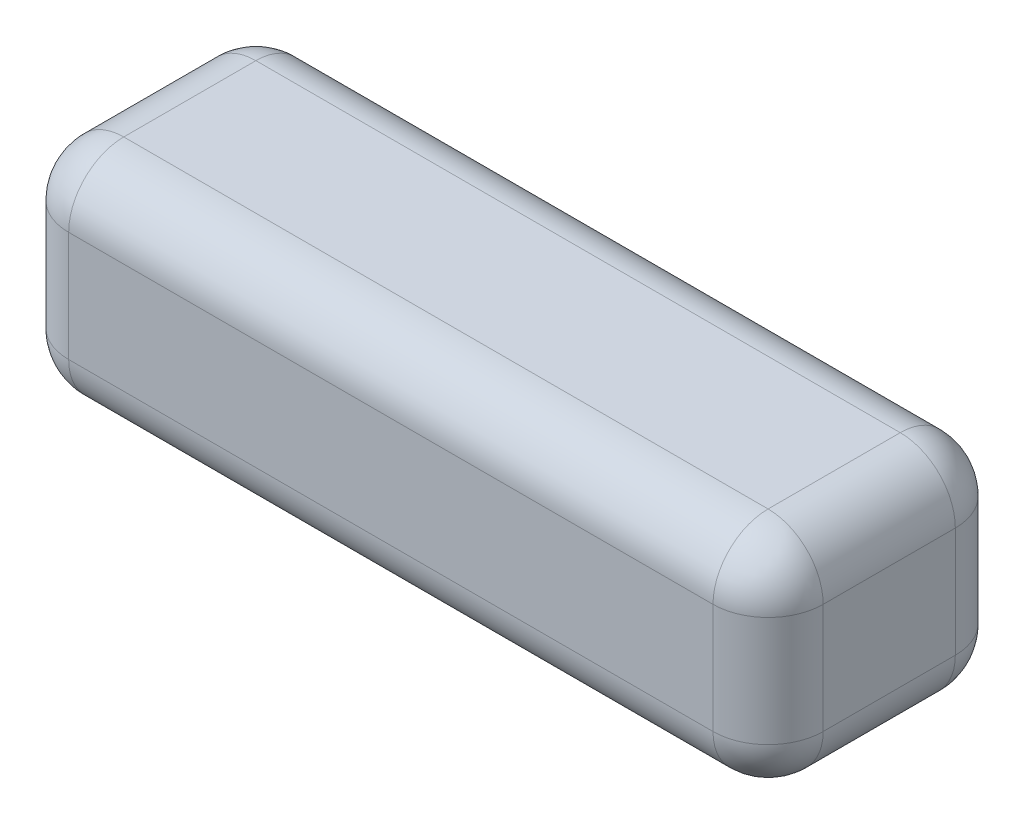
ISO-10303-21;
HEADER;
FILE_DESCRIPTION(('STEP AP214'),'2;1');
FILE_NAME('part.step','',(''),(''),'','','');
FILE_SCHEMA(('AUTOMOTIVE_DESIGN { 1 0 10303 214 1 1 1 1 }'));
ENDSEC;
DATA;
#1=APPLICATION_CONTEXT('core data for automotive mechanical design processes');
#2=APPLICATION_PROTOCOL_DEFINITION('international standard','automotive_design',2000,#1);
#3=PRODUCT_CONTEXT('',#1,'mechanical');
#4=PRODUCT('Part','Part','',(#3));
#5=PRODUCT_RELATED_PRODUCT_CATEGORY('part','',(#4));
#6=PRODUCT_DEFINITION_FORMATION('','',#4);
#7=PRODUCT_DEFINITION_CONTEXT('part definition',#1,'design');
#8=PRODUCT_DEFINITION('design','',#6,#7);
#9=PRODUCT_DEFINITION_SHAPE('','',#8);
#10=(LENGTH_UNIT() NAMED_UNIT(*) SI_UNIT(.MILLI.,.METRE.));
#11=(NAMED_UNIT(*) PLANE_ANGLE_UNIT() SI_UNIT($,.RADIAN.));
#12=(NAMED_UNIT(*) SI_UNIT($,.STERADIAN.) SOLID_ANGLE_UNIT());
#13=UNCERTAINTY_MEASURE_WITH_UNIT(LENGTH_MEASURE(1.E-05),#10,'distance_accuracy_value','');
#14=(GEOMETRIC_REPRESENTATION_CONTEXT(3) GLOBAL_UNCERTAINTY_ASSIGNED_CONTEXT((#13)) GLOBAL_UNIT_ASSIGNED_CONTEXT((#10,
#11,#12)) REPRESENTATION_CONTEXT('',''));
#15=CARTESIAN_POINT('',(0.,0.,0.));
#16=DIRECTION('',(0.,0.,1.));
#17=DIRECTION('',(1.,0.,0.));
#18=AXIS2_PLACEMENT_3D('',#15,#16,#17);
#19=CARTESIAN_POINT('',(-32.6857142857143,40.,-18.368253968254));
#20=DIRECTION('',(1.,0.,0.));
#21=DIRECTION('',(0.,0.,-1.));
#22=AXIS2_PLACEMENT_3D('',#19,#20,#21);
#23=PLANE('',#22);
#24=DIRECTION('',(0.,-1.,0.));
#25=VECTOR('',#24,1.);
#26=CARTESIAN_POINT('',(-32.6857142857143,40.,-8.36825396825397));
#27=LINE('',#26,#25);
#28=CARTESIAN_POINT('',(-32.6857142857143,30.,-8.36825396825397));
#29=VERTEX_POINT('',#28);
#30=CARTESIAN_POINT('',(-32.6857142857143,10.,-8.36825396825397));
#31=VERTEX_POINT('',#30);
#32=EDGE_CURVE('E146',#29,#31,#27,.T.);
#33=ORIENTED_EDGE('',*,*,#32,.T.);
#34=DIRECTION('',(0.,0.,1.));
#35=VECTOR('',#34,1.);
#36=CARTESIAN_POINT('',(-32.6857142857143,10.,-18.368253968254));
#37=LINE('',#36,#35);
#38=CARTESIAN_POINT('',(-32.6857142857143,10.,15.631746031746));
#39=VERTEX_POINT('',#38);
#40=EDGE_CURVE('E141',#31,#39,#37,.T.);
#41=ORIENTED_EDGE('',*,*,#40,.T.);
#42=DIRECTION('',(0.,-1.,0.));
#43=VECTOR('',#42,1.);
#44=CARTESIAN_POINT('',(-32.6857142857143,40.,15.631746031746));
#45=LINE('',#44,#43);
#46=CARTESIAN_POINT('',(-32.6857142857143,30.,15.631746031746));
#47=VERTEX_POINT('',#46);
#48=EDGE_CURVE('E136',#39,#47,#45,.F.);
#49=ORIENTED_EDGE('',*,*,#48,.T.);
#50=DIRECTION('',(0.,0.,1.));
#51=VECTOR('',#50,1.);
#52=CARTESIAN_POINT('',(-32.6857142857143,30.,-18.368253968254));
#53=LINE('',#52,#51);
#54=EDGE_CURVE('E138',#47,#29,#53,.F.);
#55=ORIENTED_EDGE('',*,*,#54,.T.);
#56=EDGE_LOOP('',(#33,#41,#49,#55));
#57=FACE_BOUND('',#56,.T.);
#58=ADVANCED_FACE('F46',(#57),#23,.F.);
#59=CARTESIAN_POINT('',(-32.6857142857143,40.,25.631746031746));
#60=DIRECTION('',(0.,0.,-1.));
#61=DIRECTION('',(-1.,0.,0.));
#62=AXIS2_PLACEMENT_3D('',#59,#60,#61);
#63=PLANE('',#62);
#64=DIRECTION('',(1.,0.,0.));
#65=VECTOR('',#64,1.);
#66=CARTESIAN_POINT('',(-32.6857142857143,30.,25.631746031746));
#67=LINE('',#66,#65);
#68=CARTESIAN_POINT('',(94.3142857142857,30.,25.631746031746));
#69=VERTEX_POINT('',#68);
#70=CARTESIAN_POINT('',(-22.6857142857143,30.,25.631746031746));
#71=VERTEX_POINT('',#70);
#72=EDGE_CURVE('E252',#69,#71,#67,.F.);
#73=ORIENTED_EDGE('',*,*,#72,.T.);
#74=DIRECTION('',(0.,-1.,0.));
#75=VECTOR('',#74,1.);
#76=CARTESIAN_POINT('',(-22.6857142857143,40.,25.631746031746));
#77=LINE('',#76,#75);
#78=CARTESIAN_POINT('',(-22.6857142857143,10.,25.631746031746));
#79=VERTEX_POINT('',#78);
#80=EDGE_CURVE('E170',#71,#79,#77,.T.);
#81=ORIENTED_EDGE('',*,*,#80,.T.);
#82=DIRECTION('',(1.,0.,0.));
#83=VECTOR('',#82,1.);
#84=CARTESIAN_POINT('',(-32.6857142857143,10.,25.631746031746));
#85=LINE('',#84,#83);
#86=CARTESIAN_POINT('',(94.3142857142857,10.,25.631746031746));
#87=VERTEX_POINT('',#86);
#88=EDGE_CURVE('E265',#79,#87,#85,.T.);
#89=ORIENTED_EDGE('',*,*,#88,.T.);
#90=DIRECTION('',(0.,-1.,0.));
#91=VECTOR('',#90,1.);
#92=CARTESIAN_POINT('',(94.3142857142857,40.,25.631746031746));
#93=LINE('',#92,#91);
#94=EDGE_CURVE('E257',#87,#69,#93,.F.);
#95=ORIENTED_EDGE('',*,*,#94,.T.);
#96=EDGE_LOOP('',(#73,#81,#89,#95));
#97=FACE_BOUND('',#96,.T.);
#98=ADVANCED_FACE('F365',(#97),#63,.F.);
#99=CARTESIAN_POINT('',(104.314285714286,40.,-18.368253968254));
#100=DIRECTION('',(-1.,0.,0.));
#101=DIRECTION('',(0.,0.,1.));
#102=AXIS2_PLACEMENT_3D('',#99,#100,#101);
#103=PLANE('',#102);
#104=DIRECTION('',(0.,-1.,0.));
#105=VECTOR('',#104,1.);
#106=CARTESIAN_POINT('',(104.314285714286,40.,15.631746031746));
#107=LINE('',#106,#105);
#108=CARTESIAN_POINT('',(104.314285714286,30.,15.631746031746));
#109=VERTEX_POINT('',#108);
#110=CARTESIAN_POINT('',(104.314285714286,10.,15.631746031746));
#111=VERTEX_POINT('',#110);
#112=EDGE_CURVE('E329',#109,#111,#107,.T.);
#113=ORIENTED_EDGE('',*,*,#112,.T.);
#114=DIRECTION('',(0.,0.,-1.));
#115=VECTOR('',#114,1.);
#116=CARTESIAN_POINT('',(104.314285714286,10.,-18.368253968254));
#117=LINE('',#116,#115);
#118=CARTESIAN_POINT('',(104.314285714286,10.,-8.36825396825397));
#119=VERTEX_POINT('',#118);
#120=EDGE_CURVE('E334',#111,#119,#117,.T.);
#121=ORIENTED_EDGE('',*,*,#120,.T.);
#122=DIRECTION('',(0.,-1.,0.));
#123=VECTOR('',#122,1.);
#124=CARTESIAN_POINT('',(104.314285714286,40.,-8.36825396825397));
#125=LINE('',#124,#123);
#126=CARTESIAN_POINT('',(104.314285714286,30.,-8.36825396825397));
#127=VERTEX_POINT('',#126);
#128=EDGE_CURVE('E246',#119,#127,#125,.F.);
#129=ORIENTED_EDGE('',*,*,#128,.T.);
#130=DIRECTION('',(0.,0.,-1.));
#131=VECTOR('',#130,1.);
#132=CARTESIAN_POINT('',(104.314285714286,30.,25.631746031746));
#133=LINE('',#132,#131);
#134=EDGE_CURVE('E310',#127,#109,#133,.F.);
#135=ORIENTED_EDGE('',*,*,#134,.T.);
#136=EDGE_LOOP('',(#113,#121,#129,#135));
#137=FACE_BOUND('',#136,.T.);
#138=ADVANCED_FACE('F370',(#137),#103,.F.);
#139=CARTESIAN_POINT('',(-32.6857142857143,40.,-18.368253968254));
#140=DIRECTION('',(0.,0.,1.));
#141=DIRECTION('',(1.,0.,0.));
#142=AXIS2_PLACEMENT_3D('',#139,#140,#141);
#143=PLANE('',#142);
#144=DIRECTION('',(-1.,0.,0.));
#145=VECTOR('',#144,1.);
#146=CARTESIAN_POINT('',(104.314285714286,30.,-18.368253968254));
#147=LINE('',#146,#145);
#148=CARTESIAN_POINT('',(-22.6857142857143,30.,-18.368253968254));
#149=VERTEX_POINT('',#148);
#150=CARTESIAN_POINT('',(94.3142857142857,30.,-18.368253968254));
#151=VERTEX_POINT('',#150);
#152=EDGE_CURVE('E337',#149,#151,#147,.F.);
#153=ORIENTED_EDGE('',*,*,#152,.T.);
#154=DIRECTION('',(0.,-1.,0.));
#155=VECTOR('',#154,1.);
#156=CARTESIAN_POINT('',(94.3142857142857,40.,-18.368253968254));
#157=LINE('',#156,#155);
#158=CARTESIAN_POINT('',(94.3142857142857,10.,-18.368253968254));
#159=VERTEX_POINT('',#158);
#160=EDGE_CURVE('E249',#151,#159,#157,.T.);
#161=ORIENTED_EDGE('',*,*,#160,.T.);
#162=DIRECTION('',(-1.,0.,0.));
#163=VECTOR('',#162,1.);
#164=CARTESIAN_POINT('',(-32.6857142857143,10.,-18.368253968254));
#165=LINE('',#164,#163);
#166=CARTESIAN_POINT('',(-22.6857142857143,10.,-18.368253968254));
#167=VERTEX_POINT('',#166);
#168=EDGE_CURVE('E253',#159,#167,#165,.T.);
#169=ORIENTED_EDGE('',*,*,#168,.T.);
#170=DIRECTION('',(0.,-1.,0.));
#171=VECTOR('',#170,1.);
#172=CARTESIAN_POINT('',(-22.6857142857143,40.,-18.368253968254));
#173=LINE('',#172,#171);
#174=EDGE_CURVE('E259',#167,#149,#173,.F.);
#175=ORIENTED_EDGE('',*,*,#174,.T.);
#176=EDGE_LOOP('',(#153,#161,#169,#175));
#177=FACE_BOUND('',#176,.T.);
#178=ADVANCED_FACE('F342',(#177),#143,.F.);
#179=CARTESIAN_POINT('',(0.,40.,0.));
#180=DIRECTION('',(0.,1.,0.));
#181=DIRECTION('',(0.,0.,1.));
#182=AXIS2_PLACEMENT_3D('',#179,#180,#181);
#183=PLANE('',#182);
#184=DIRECTION('',(1.,0.,0.));
#185=VECTOR('',#184,1.);
#186=CARTESIAN_POINT('',(104.314285714286,40.,15.631746031746));
#187=LINE('',#186,#185);
#188=CARTESIAN_POINT('',(-22.6857142857143,40.,15.631746031746));
#189=VERTEX_POINT('',#188);
#190=CARTESIAN_POINT('',(94.3142857142857,40.,15.631746031746));
#191=VERTEX_POINT('',#190);
#192=EDGE_CURVE('E270',#189,#191,#187,.T.);
#193=ORIENTED_EDGE('',*,*,#192,.T.);
#194=DIRECTION('',(0.,0.,-1.));
#195=VECTOR('',#194,1.);
#196=CARTESIAN_POINT('',(94.3142857142857,40.,-18.368253968254));
#197=LINE('',#196,#195);
#198=CARTESIAN_POINT('',(94.3142857142857,40.,-8.36825396825397));
#199=VERTEX_POINT('',#198);
#200=EDGE_CURVE('E11',#191,#199,#197,.T.);
#201=ORIENTED_EDGE('',*,*,#200,.T.);
#202=DIRECTION('',(-1.,0.,0.));
#203=VECTOR('',#202,1.);
#204=CARTESIAN_POINT('',(-32.6857142857143,40.,-8.36825396825397));
#205=LINE('',#204,#203);
#206=CARTESIAN_POINT('',(-22.6857142857143,40.,-8.36825396825397));
#207=VERTEX_POINT('',#206);
#208=EDGE_CURVE('E56',#199,#207,#205,.T.);
#209=ORIENTED_EDGE('',*,*,#208,.T.);
#210=DIRECTION('',(0.,0.,1.));
#211=VECTOR('',#210,1.);
#212=CARTESIAN_POINT('',(-22.6857142857143,40.,25.631746031746));
#213=LINE('',#212,#211);
#214=EDGE_CURVE('E273',#207,#189,#213,.T.);
#215=ORIENTED_EDGE('',*,*,#214,.T.);
#216=EDGE_LOOP('',(#193,#201,#209,#215));
#217=FACE_BOUND('',#216,.T.);
#218=ADVANCED_FACE('F401',(#217),#183,.T.);
#219=CARTESIAN_POINT('',(0.,0.,0.));
#220=DIRECTION('',(0.,1.,0.));
#221=DIRECTION('',(0.,0.,1.));
#222=AXIS2_PLACEMENT_3D('',#219,#220,#221);
#223=PLANE('',#222);
#224=DIRECTION('',(0.,0.,1.));
#225=VECTOR('',#224,1.);
#226=CARTESIAN_POINT('',(-22.6857142857143,0.,0.));
#227=LINE('',#226,#225);
#228=CARTESIAN_POINT('',(-22.6857142857143,0.,15.631746031746));
#229=VERTEX_POINT('',#228);
#230=CARTESIAN_POINT('',(-22.6857142857143,0.,-8.36825396825397));
#231=VERTEX_POINT('',#230);
#232=EDGE_CURVE('E311',#229,#231,#227,.F.);
#233=ORIENTED_EDGE('',*,*,#232,.T.);
#234=DIRECTION('',(-1.,0.,0.));
#235=VECTOR('',#234,1.);
#236=CARTESIAN_POINT('',(0.,0.,-8.36825396825397));
#237=LINE('',#236,#235);
#238=CARTESIAN_POINT('',(94.3142857142857,0.,-8.36825396825397));
#239=VERTEX_POINT('',#238);
#240=EDGE_CURVE('E303',#231,#239,#237,.F.);
#241=ORIENTED_EDGE('',*,*,#240,.T.);
#242=DIRECTION('',(0.,0.,-1.));
#243=VECTOR('',#242,1.);
#244=CARTESIAN_POINT('',(94.3142857142857,0.,0.));
#245=LINE('',#244,#243);
#246=CARTESIAN_POINT('',(94.3142857142857,0.,15.631746031746));
#247=VERTEX_POINT('',#246);
#248=EDGE_CURVE('E321',#239,#247,#245,.F.);
#249=ORIENTED_EDGE('',*,*,#248,.T.);
#250=DIRECTION('',(1.,0.,0.));
#251=VECTOR('',#250,1.);
#252=CARTESIAN_POINT('',(0.,0.,15.631746031746));
#253=LINE('',#252,#251);
#254=EDGE_CURVE('E316',#247,#229,#253,.F.);
#255=ORIENTED_EDGE('',*,*,#254,.T.);
#256=EDGE_LOOP('',(#233,#241,#249,#255));
#257=FACE_BOUND('',#256,.T.);
#258=ADVANCED_FACE('F314',(#257),#223,.F.);
#259=CARTESIAN_POINT('',(94.3142857142857,30.,0.));
#260=DIRECTION('',(0.,0.,1.));
#261=DIRECTION('',(1.,0.,0.));
#262=AXIS2_PLACEMENT_3D('',#259,#260,#261);
#263=CYLINDRICAL_SURFACE('',#262,10.);
#264=CARTESIAN_POINT('',(94.3142857142857,30.,-8.36825396825397));
#265=DIRECTION('',(0.,0.,-1.));
#266=DIRECTION('',(-1.,0.,0.));
#267=AXIS2_PLACEMENT_3D('',#264,#265,#266);
#268=CIRCLE('',#267,10.);
#269=EDGE_CURVE('E50',#199,#127,#268,.T.);
#270=ORIENTED_EDGE('',*,*,#269,.F.);
#271=ORIENTED_EDGE('',*,*,#200,.F.);
#272=CARTESIAN_POINT('',(94.3142857142857,30.,15.631746031746));
#273=DIRECTION('',(0.,0.,1.));
#274=DIRECTION('',(0.,-1.,0.));
#275=AXIS2_PLACEMENT_3D('',#272,#273,#274);
#276=CIRCLE('',#275,10.);
#277=EDGE_CURVE('E225',#109,#191,#276,.T.);
#278=ORIENTED_EDGE('',*,*,#277,.F.);
#279=ORIENTED_EDGE('',*,*,#134,.F.);
#280=EDGE_LOOP('',(#270,#271,#278,#279));
#281=FACE_BOUND('',#280,.T.);
#282=ADVANCED_FACE('F48',(#281),#263,.T.);
#283=CARTESIAN_POINT('',(94.3142857142857,30.,-8.36825396825397));
#284=DIRECTION('',(1.,0.,0.));
#285=DIRECTION('',(0.,0.,-1.));
#286=AXIS2_PLACEMENT_3D('',#283,#284,#285);
#287=SPHERICAL_SURFACE('',#286,10.);
#288=CARTESIAN_POINT('',(94.3142857142857,30.,-8.36825396825397));
#289=DIRECTION('',(1.,0.,0.));
#290=DIRECTION('',(0.,1.,0.));
#291=AXIS2_PLACEMENT_3D('',#288,#289,#290);
#292=CIRCLE('',#291,10.);
#293=EDGE_CURVE('E219',#199,#151,#292,.F.);
#294=ORIENTED_EDGE('',*,*,#293,.F.);
#295=ORIENTED_EDGE('',*,*,#269,.T.);
#296=CARTESIAN_POINT('',(94.3142857142857,30.,-8.36825396825397));
#297=DIRECTION('',(0.,1.,0.));
#298=DIRECTION('',(0.,0.,1.));
#299=AXIS2_PLACEMENT_3D('',#296,#297,#298);
#300=CIRCLE('',#299,10.);
#301=EDGE_CURVE('E222',#151,#127,#300,.F.);
#302=ORIENTED_EDGE('',*,*,#301,.F.);
#303=EDGE_LOOP('',(#294,#295,#302));
#304=FACE_BOUND('',#303,.T.);
#305=ADVANCED_FACE('F237',(#304),#287,.T.);
#306=CARTESIAN_POINT('',(94.3142857142857,30.,15.631746031746));
#307=DIRECTION('',(0.,1.,0.));
#308=DIRECTION('',(0.,0.,1.));
#309=AXIS2_PLACEMENT_3D('',#306,#307,#308);
#310=SPHERICAL_SURFACE('',#309,10.);
#311=CARTESIAN_POINT('',(94.3142857142857,30.,15.631746031746));
#312=DIRECTION('',(0.,1.,0.));
#313=DIRECTION('',(0.,0.,1.));
#314=AXIS2_PLACEMENT_3D('',#311,#312,#313);
#315=CIRCLE('',#314,10.);
#316=EDGE_CURVE('E211',#109,#69,#315,.F.);
#317=ORIENTED_EDGE('',*,*,#316,.F.);
#318=ORIENTED_EDGE('',*,*,#277,.T.);
#319=CARTESIAN_POINT('',(94.3142857142857,30.,15.631746031746));
#320=DIRECTION('',(1.,0.,0.));
#321=DIRECTION('',(0.,0.,-1.));
#322=AXIS2_PLACEMENT_3D('',#319,#320,#321);
#323=CIRCLE('',#322,10.);
#324=EDGE_CURVE('E215',#69,#191,#323,.F.);
#325=ORIENTED_EDGE('',*,*,#324,.F.);
#326=EDGE_LOOP('',(#317,#318,#325));
#327=FACE_BOUND('',#326,.T.);
#328=ADVANCED_FACE('F402',(#327),#310,.T.);
#329=CARTESIAN_POINT('',(94.3142857142857,40.,-8.36825396825397));
#330=DIRECTION('',(0.,-1.,0.));
#331=DIRECTION('',(0.,0.,-1.));
#332=AXIS2_PLACEMENT_3D('',#329,#330,#331);
#333=CYLINDRICAL_SURFACE('',#332,10.);
#334=ORIENTED_EDGE('',*,*,#301,.T.);
#335=ORIENTED_EDGE('',*,*,#128,.F.);
#336=CARTESIAN_POINT('',(94.3142857142857,10.,-8.36825396825397));
#337=DIRECTION('',(0.,-1.,0.));
#338=DIRECTION('',(0.,0.,-1.));
#339=AXIS2_PLACEMENT_3D('',#336,#337,#338);
#340=CIRCLE('',#339,10.);
#341=EDGE_CURVE('E204',#159,#119,#340,.T.);
#342=ORIENTED_EDGE('',*,*,#341,.F.);
#343=ORIENTED_EDGE('',*,*,#160,.F.);
#344=EDGE_LOOP('',(#334,#335,#342,#343));
#345=FACE_BOUND('',#344,.T.);
#346=ADVANCED_FACE('F244',(#345),#333,.T.);
#347=CARTESIAN_POINT('',(0.,30.,-8.36825396825397));
#348=DIRECTION('',(1.,0.,0.));
#349=DIRECTION('',(0.,0.,-1.));
#350=AXIS2_PLACEMENT_3D('',#347,#348,#349);
#351=CYLINDRICAL_SURFACE('',#350,10.);
#352=ORIENTED_EDGE('',*,*,#293,.T.);
#353=ORIENTED_EDGE('',*,*,#152,.F.);
#354=CARTESIAN_POINT('',(-22.6857142857143,30.,-8.36825396825397));
#355=DIRECTION('',(-1.,0.,0.));
#356=DIRECTION('',(0.,0.,1.));
#357=AXIS2_PLACEMENT_3D('',#354,#355,#356);
#358=CIRCLE('',#357,10.);
#359=EDGE_CURVE('E200',#207,#149,#358,.T.);
#360=ORIENTED_EDGE('',*,*,#359,.F.);
#361=ORIENTED_EDGE('',*,*,#208,.F.);
#362=EDGE_LOOP('',(#352,#353,#360,#361));
#363=FACE_BOUND('',#362,.T.);
#364=ADVANCED_FACE('F344',(#363),#351,.T.);
#365=CARTESIAN_POINT('',(-22.6857142857143,30.,0.));
#366=DIRECTION('',(0.,0.,-1.));
#367=DIRECTION('',(-1.,0.,0.));
#368=AXIS2_PLACEMENT_3D('',#365,#366,#367);
#369=CYLINDRICAL_SURFACE('',#368,10.);
#370=CARTESIAN_POINT('',(-22.6857142857143,30.,15.631746031746));
#371=DIRECTION('',(0.,0.,1.));
#372=DIRECTION('',(1.,0.,0.));
#373=AXIS2_PLACEMENT_3D('',#370,#371,#372);
#374=CIRCLE('',#373,10.);
#375=EDGE_CURVE('E152',#189,#47,#374,.T.);
#376=ORIENTED_EDGE('',*,*,#375,.F.);
#377=ORIENTED_EDGE('',*,*,#214,.F.);
#378=CARTESIAN_POINT('',(-22.6857142857143,30.,-8.36825396825397));
#379=DIRECTION('',(0.,0.,-1.));
#380=DIRECTION('',(-1.,0.,0.));
#381=AXIS2_PLACEMENT_3D('',#378,#379,#380);
#382=CIRCLE('',#381,10.);
#383=EDGE_CURVE('E155',#29,#207,#382,.T.);
#384=ORIENTED_EDGE('',*,*,#383,.F.);
#385=ORIENTED_EDGE('',*,*,#54,.F.);
#386=EDGE_LOOP('',(#376,#377,#384,#385));
#387=FACE_BOUND('',#386,.T.);
#388=ADVANCED_FACE('F151',(#387),#369,.T.);
#389=CARTESIAN_POINT('',(0.,30.,15.631746031746));
#390=DIRECTION('',(-1.,0.,0.));
#391=DIRECTION('',(0.,0.,1.));
#392=AXIS2_PLACEMENT_3D('',#389,#390,#391);
#393=CYLINDRICAL_SURFACE('',#392,10.);
#394=ORIENTED_EDGE('',*,*,#324,.T.);
#395=ORIENTED_EDGE('',*,*,#192,.F.);
#396=CARTESIAN_POINT('',(-22.6857142857143,30.,15.631746031746));
#397=DIRECTION('',(-1.,0.,0.));
#398=DIRECTION('',(0.,0.,1.));
#399=AXIS2_PLACEMENT_3D('',#396,#397,#398);
#400=CIRCLE('',#399,10.);
#401=EDGE_CURVE('E165',#71,#189,#400,.T.);
#402=ORIENTED_EDGE('',*,*,#401,.F.);
#403=ORIENTED_EDGE('',*,*,#72,.F.);
#404=EDGE_LOOP('',(#394,#395,#402,#403));
#405=FACE_BOUND('',#404,.T.);
#406=ADVANCED_FACE('F400',(#405),#393,.T.);
#407=CARTESIAN_POINT('',(94.3142857142857,40.,15.631746031746));
#408=DIRECTION('',(0.,-1.,0.));
#409=DIRECTION('',(0.,0.,-1.));
#410=AXIS2_PLACEMENT_3D('',#407,#408,#409);
#411=CYLINDRICAL_SURFACE('',#410,10.);
#412=ORIENTED_EDGE('',*,*,#316,.T.);
#413=ORIENTED_EDGE('',*,*,#94,.F.);
#414=CARTESIAN_POINT('',(94.3142857142857,10.,15.631746031746));
#415=DIRECTION('',(0.,-1.,0.));
#416=DIRECTION('',(0.,0.,-1.));
#417=AXIS2_PLACEMENT_3D('',#414,#415,#416);
#418=CIRCLE('',#417,10.);
#419=EDGE_CURVE('E192',#111,#87,#418,.T.);
#420=ORIENTED_EDGE('',*,*,#419,.F.);
#421=ORIENTED_EDGE('',*,*,#112,.F.);
#422=EDGE_LOOP('',(#412,#413,#420,#421));
#423=FACE_BOUND('',#422,.T.);
#424=ADVANCED_FACE('F396',(#423),#411,.T.);
#425=CARTESIAN_POINT('',(94.3142857142857,10.,-18.368253968254));
#426=DIRECTION('',(0.,0.,-1.));
#427=DIRECTION('',(-1.,0.,0.));
#428=AXIS2_PLACEMENT_3D('',#425,#426,#427);
#429=CYLINDRICAL_SURFACE('',#428,10.);
#430=CARTESIAN_POINT('',(94.3142857142857,10.,-8.36825396825397));
#431=DIRECTION('',(0.,0.,-1.));
#432=DIRECTION('',(-1.,0.,0.));
#433=AXIS2_PLACEMENT_3D('',#430,#431,#432);
#434=CIRCLE('',#433,10.);
#435=EDGE_CURVE('E207',#119,#239,#434,.T.);
#436=ORIENTED_EDGE('',*,*,#435,.F.);
#437=ORIENTED_EDGE('',*,*,#120,.F.);
#438=CARTESIAN_POINT('',(94.3142857142857,10.,15.631746031746));
#439=DIRECTION('',(0.,0.,1.));
#440=DIRECTION('',(1.,0.,0.));
#441=AXIS2_PLACEMENT_3D('',#438,#439,#440);
#442=CIRCLE('',#441,10.);
#443=EDGE_CURVE('E188',#247,#111,#442,.T.);
#444=ORIENTED_EDGE('',*,*,#443,.F.);
#445=ORIENTED_EDGE('',*,*,#248,.F.);
#446=EDGE_LOOP('',(#436,#437,#444,#445));
#447=FACE_BOUND('',#446,.T.);
#448=ADVANCED_FACE('F419',(#447),#429,.T.);
#449=CARTESIAN_POINT('',(94.3142857142857,10.,-8.36825396825397));
#450=DIRECTION('',(1.,0.,0.));
#451=DIRECTION('',(0.,1.,0.));
#452=AXIS2_PLACEMENT_3D('',#449,#450,#451);
#453=SPHERICAL_SURFACE('',#452,10.);
#454=ORIENTED_EDGE('',*,*,#341,.T.);
#455=ORIENTED_EDGE('',*,*,#435,.T.);
#456=CARTESIAN_POINT('',(94.3142857142857,10.,-8.36825396825397));
#457=DIRECTION('',(1.,0.,0.));
#458=DIRECTION('',(0.,0.,-1.));
#459=AXIS2_PLACEMENT_3D('',#456,#457,#458);
#460=CIRCLE('',#459,10.);
#461=EDGE_CURVE('E178',#159,#239,#460,.F.);
#462=ORIENTED_EDGE('',*,*,#461,.F.);
#463=EDGE_LOOP('',(#454,#455,#462));
#464=FACE_BOUND('',#463,.T.);
#465=ADVANCED_FACE('F422',(#464),#453,.T.);
#466=CARTESIAN_POINT('',(-22.6857142857143,30.,-8.36825396825397));
#467=DIRECTION('',(0.,1.,0.));
#468=DIRECTION('',(0.,0.,1.));
#469=AXIS2_PLACEMENT_3D('',#466,#467,#468);
#470=SPHERICAL_SURFACE('',#469,10.);
#471=ORIENTED_EDGE('',*,*,#383,.T.);
#472=ORIENTED_EDGE('',*,*,#359,.T.);
#473=CARTESIAN_POINT('',(-22.6857142857143,30.,-8.36825396825397));
#474=DIRECTION('',(0.,1.,0.));
#475=DIRECTION('',(0.,0.,1.));
#476=AXIS2_PLACEMENT_3D('',#473,#474,#475);
#477=CIRCLE('',#476,10.);
#478=EDGE_CURVE('E172',#29,#149,#477,.F.);
#479=ORIENTED_EDGE('',*,*,#478,.F.);
#480=EDGE_LOOP('',(#471,#472,#479));
#481=FACE_BOUND('',#480,.T.);
#482=ADVANCED_FACE('F346',(#481),#470,.T.);
#483=CARTESIAN_POINT('',(-22.6857142857143,30.,15.631746031746));
#484=DIRECTION('',(0.,1.,0.));
#485=DIRECTION('',(0.,0.,1.));
#486=AXIS2_PLACEMENT_3D('',#483,#484,#485);
#487=SPHERICAL_SURFACE('',#486,10.);
#488=ORIENTED_EDGE('',*,*,#401,.T.);
#489=ORIENTED_EDGE('',*,*,#375,.T.);
#490=CARTESIAN_POINT('',(-22.6857142857143,30.,15.631746031746));
#491=DIRECTION('',(0.,1.,0.));
#492=DIRECTION('',(0.,0.,1.));
#493=AXIS2_PLACEMENT_3D('',#490,#491,#492);
#494=CIRCLE('',#493,10.);
#495=EDGE_CURVE('E162',#71,#47,#494,.F.);
#496=ORIENTED_EDGE('',*,*,#495,.F.);
#497=EDGE_LOOP('',(#488,#489,#496));
#498=FACE_BOUND('',#497,.T.);
#499=ADVANCED_FACE('F161',(#498),#487,.T.);
#500=CARTESIAN_POINT('',(94.3142857142857,10.,15.631746031746));
#501=DIRECTION('',(1.,0.,0.));
#502=DIRECTION('',(0.,0.,-1.));
#503=AXIS2_PLACEMENT_3D('',#500,#501,#502);
#504=SPHERICAL_SURFACE('',#503,10.);
#505=ORIENTED_EDGE('',*,*,#443,.T.);
#506=ORIENTED_EDGE('',*,*,#419,.T.);
#507=CARTESIAN_POINT('',(94.3142857142857,10.,15.631746031746));
#508=DIRECTION('',(1.,0.,0.));
#509=DIRECTION('',(0.,0.,-1.));
#510=AXIS2_PLACEMENT_3D('',#507,#508,#509);
#511=CIRCLE('',#510,10.);
#512=EDGE_CURVE('E173',#247,#87,#511,.F.);
#513=ORIENTED_EDGE('',*,*,#512,.F.);
#514=EDGE_LOOP('',(#505,#506,#513));
#515=FACE_BOUND('',#514,.T.);
#516=ADVANCED_FACE('F362',(#515),#504,.T.);
#517=CARTESIAN_POINT('',(-32.6857142857143,10.,-8.36825396825397));
#518=DIRECTION('',(-1.,0.,0.));
#519=DIRECTION('',(0.,0.,1.));
#520=AXIS2_PLACEMENT_3D('',#517,#518,#519);
#521=CYLINDRICAL_SURFACE('',#520,10.);
#522=ORIENTED_EDGE('',*,*,#461,.T.);
#523=ORIENTED_EDGE('',*,*,#240,.F.);
#524=CARTESIAN_POINT('',(-22.6857142857143,10.,-8.36825396825397));
#525=DIRECTION('',(-1.,0.,0.));
#526=DIRECTION('',(0.,0.,1.));
#527=AXIS2_PLACEMENT_3D('',#524,#525,#526);
#528=CIRCLE('',#527,10.);
#529=EDGE_CURVE('E181',#167,#231,#528,.T.);
#530=ORIENTED_EDGE('',*,*,#529,.F.);
#531=ORIENTED_EDGE('',*,*,#168,.F.);
#532=EDGE_LOOP('',(#522,#523,#530,#531));
#533=FACE_BOUND('',#532,.T.);
#534=ADVANCED_FACE('F305',(#533),#521,.T.);
#535=CARTESIAN_POINT('',(-22.6857142857143,40.,-8.36825396825397));
#536=DIRECTION('',(0.,-1.,0.));
#537=DIRECTION('',(0.,0.,-1.));
#538=AXIS2_PLACEMENT_3D('',#535,#536,#537);
#539=CYLINDRICAL_SURFACE('',#538,10.);
#540=ORIENTED_EDGE('',*,*,#478,.T.);
#541=ORIENTED_EDGE('',*,*,#174,.F.);
#542=CARTESIAN_POINT('',(-22.6857142857143,10.,-8.36825396825397));
#543=DIRECTION('',(0.,-1.,0.));
#544=DIRECTION('',(0.,0.,-1.));
#545=AXIS2_PLACEMENT_3D('',#542,#543,#544);
#546=CIRCLE('',#545,10.);
#547=EDGE_CURVE('E291',#31,#167,#546,.T.);
#548=ORIENTED_EDGE('',*,*,#547,.F.);
#549=ORIENTED_EDGE('',*,*,#32,.F.);
#550=EDGE_LOOP('',(#540,#541,#548,#549));
#551=FACE_BOUND('',#550,.T.);
#552=ADVANCED_FACE('F348',(#551),#539,.T.);
#553=CARTESIAN_POINT('',(-22.6857142857143,40.,15.631746031746));
#554=DIRECTION('',(0.,-1.,0.));
#555=DIRECTION('',(0.,0.,-1.));
#556=AXIS2_PLACEMENT_3D('',#553,#554,#555);
#557=CYLINDRICAL_SURFACE('',#556,10.);
#558=ORIENTED_EDGE('',*,*,#495,.T.);
#559=ORIENTED_EDGE('',*,*,#48,.F.);
#560=CARTESIAN_POINT('',(-22.6857142857143,10.,15.631746031746));
#561=DIRECTION('',(0.,-1.,0.));
#562=DIRECTION('',(0.,0.,-1.));
#563=AXIS2_PLACEMENT_3D('',#560,#561,#562);
#564=CIRCLE('',#563,10.);
#565=EDGE_CURVE('E287',#79,#39,#564,.T.);
#566=ORIENTED_EDGE('',*,*,#565,.F.);
#567=ORIENTED_EDGE('',*,*,#80,.F.);
#568=EDGE_LOOP('',(#558,#559,#566,#567));
#569=FACE_BOUND('',#568,.T.);
#570=ADVANCED_FACE('F168',(#569),#557,.T.);
#571=CARTESIAN_POINT('',(-32.6857142857143,10.,15.631746031746));
#572=DIRECTION('',(1.,0.,0.));
#573=DIRECTION('',(0.,0.,-1.));
#574=AXIS2_PLACEMENT_3D('',#571,#572,#573);
#575=CYLINDRICAL_SURFACE('',#574,10.);
#576=ORIENTED_EDGE('',*,*,#512,.T.);
#577=ORIENTED_EDGE('',*,*,#88,.F.);
#578=CARTESIAN_POINT('',(-22.6857142857143,10.,15.631746031746));
#579=DIRECTION('',(-1.,0.,0.));
#580=DIRECTION('',(0.,0.,1.));
#581=AXIS2_PLACEMENT_3D('',#578,#579,#580);
#582=CIRCLE('',#581,10.);
#583=EDGE_CURVE('E284',#229,#79,#582,.T.);
#584=ORIENTED_EDGE('',*,*,#583,.F.);
#585=ORIENTED_EDGE('',*,*,#254,.F.);
#586=EDGE_LOOP('',(#576,#577,#584,#585));
#587=FACE_BOUND('',#586,.T.);
#588=ADVANCED_FACE('F360',(#587),#575,.T.);
#589=CARTESIAN_POINT('',(-22.6857142857143,10.,-8.36825396825397));
#590=DIRECTION('',(0.,0.,-1.));
#591=DIRECTION('',(0.,1.,0.));
#592=AXIS2_PLACEMENT_3D('',#589,#590,#591);
#593=SPHERICAL_SURFACE('',#592,10.);
#594=ORIENTED_EDGE('',*,*,#547,.T.);
#595=ORIENTED_EDGE('',*,*,#529,.T.);
#596=CARTESIAN_POINT('',(-22.6857142857143,10.,-8.36825396825397));
#597=DIRECTION('',(0.,0.,-1.));
#598=DIRECTION('',(-1.,0.,0.));
#599=AXIS2_PLACEMENT_3D('',#596,#597,#598);
#600=CIRCLE('',#599,10.);
#601=EDGE_CURVE('E281',#31,#231,#600,.F.);
#602=ORIENTED_EDGE('',*,*,#601,.F.);
#603=EDGE_LOOP('',(#594,#595,#602));
#604=FACE_BOUND('',#603,.T.);
#605=ADVANCED_FACE('F300',(#604),#593,.T.);
#606=CARTESIAN_POINT('',(-22.6857142857143,10.,15.631746031746));
#607=DIRECTION('',(0.,0.,1.));
#608=DIRECTION('',(0.,-1.,0.));
#609=AXIS2_PLACEMENT_3D('',#606,#607,#608);
#610=SPHERICAL_SURFACE('',#609,10.);
#611=ORIENTED_EDGE('',*,*,#583,.T.);
#612=ORIENTED_EDGE('',*,*,#565,.T.);
#613=CARTESIAN_POINT('',(-22.6857142857143,10.,15.631746031746));
#614=DIRECTION('',(0.,0.,1.));
#615=DIRECTION('',(1.,0.,0.));
#616=AXIS2_PLACEMENT_3D('',#613,#614,#615);
#617=CIRCLE('',#616,10.);
#618=EDGE_CURVE('E278',#229,#39,#617,.F.);
#619=ORIENTED_EDGE('',*,*,#618,.F.);
#620=EDGE_LOOP('',(#611,#612,#619));
#621=FACE_BOUND('',#620,.T.);
#622=ADVANCED_FACE('F378',(#621),#610,.T.);
#623=CARTESIAN_POINT('',(-22.6857142857143,10.,-18.368253968254));
#624=DIRECTION('',(0.,0.,1.));
#625=DIRECTION('',(1.,0.,0.));
#626=AXIS2_PLACEMENT_3D('',#623,#624,#625);
#627=CYLINDRICAL_SURFACE('',#626,10.);
#628=ORIENTED_EDGE('',*,*,#601,.T.);
#629=ORIENTED_EDGE('',*,*,#232,.F.);
#630=ORIENTED_EDGE('',*,*,#618,.T.);
#631=ORIENTED_EDGE('',*,*,#40,.F.);
#632=EDGE_LOOP('',(#628,#629,#630,#631));
#633=FACE_BOUND('',#632,.T.);
#634=ADVANCED_FACE('F375',(#633),#627,.T.);
#635=CLOSED_SHELL('',(#58,#98,#138,#178,#218,#258,#282,#305,#328,#346,#364,#388,#406,#424,#448,
#465,#482,#499,#516,#534,#552,#570,#588,#605,#622,#634));
#636=MANIFOLD_SOLID_BREP('B2',#635);
#637=ADVANCED_BREP_SHAPE_REPRESENTATION('',(#18,#636),#14);
#638=SHAPE_DEFINITION_REPRESENTATION(#9,#637);
ENDSEC;
END-ISO-10303-21;
